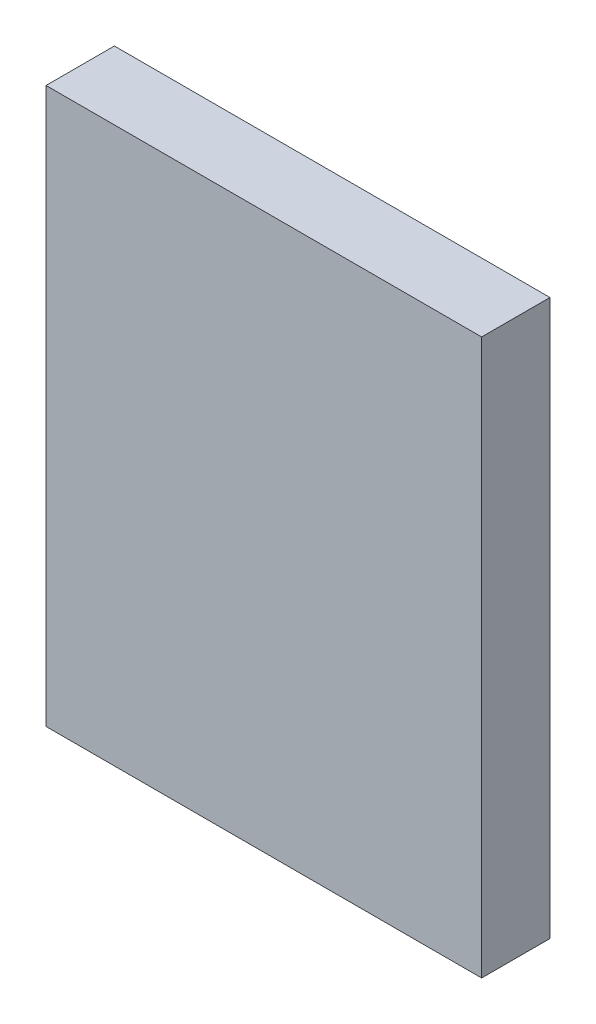
ISO-10303-21;
HEADER;
FILE_DESCRIPTION(('STEP AP214'),'2;1');
FILE_NAME('part.step','',(''),(''),'','','');
FILE_SCHEMA(('AUTOMOTIVE_DESIGN { 1 0 10303 214 1 1 1 1 }'));
ENDSEC;
DATA;
#1=APPLICATION_CONTEXT('core data for automotive mechanical design processes');
#2=APPLICATION_PROTOCOL_DEFINITION('international standard','automotive_design',2000,#1);
#3=PRODUCT_CONTEXT('',#1,'mechanical');
#4=PRODUCT('Part','Part','',(#3));
#5=PRODUCT_RELATED_PRODUCT_CATEGORY('part','',(#4));
#6=PRODUCT_DEFINITION_FORMATION('','',#4);
#7=PRODUCT_DEFINITION_CONTEXT('part definition',#1,'design');
#8=PRODUCT_DEFINITION('design','',#6,#7);
#9=PRODUCT_DEFINITION_SHAPE('','',#8);
#10=(LENGTH_UNIT() NAMED_UNIT(*) SI_UNIT(.MILLI.,.METRE.));
#11=(NAMED_UNIT(*) PLANE_ANGLE_UNIT() SI_UNIT($,.RADIAN.));
#12=(NAMED_UNIT(*) SI_UNIT($,.STERADIAN.) SOLID_ANGLE_UNIT());
#13=UNCERTAINTY_MEASURE_WITH_UNIT(LENGTH_MEASURE(1.E-05),#10,'distance_accuracy_value','');
#14=(GEOMETRIC_REPRESENTATION_CONTEXT(3) GLOBAL_UNCERTAINTY_ASSIGNED_CONTEXT((#13)) GLOBAL_UNIT_ASSIGNED_CONTEXT((#10,
#11,#12)) REPRESENTATION_CONTEXT('',''));
#15=CARTESIAN_POINT('',(0.,0.,0.));
#16=DIRECTION('',(0.,0.,1.));
#17=DIRECTION('',(1.,0.,0.));
#18=AXIS2_PLACEMENT_3D('',#15,#16,#17);
#19=CARTESIAN_POINT('',(-25.8890638481449,19.5723684210526,8.));
#20=DIRECTION('',(1.,0.,0.));
#21=DIRECTION('',(0.,1.,0.));
#22=AXIS2_PLACEMENT_3D('',#19,#20,#21);
#23=PLANE('',#22);
#24=DIRECTION('',(0.,-1.,0.));
#25=VECTOR('',#24,1.);
#26=CARTESIAN_POINT('',(-25.8890638481449,19.5723684210526,0.));
#27=LINE('',#26,#25);
#28=CARTESIAN_POINT('',(-25.8890638481449,19.5723684210526,0.));
#29=VERTEX_POINT('',#28);
#30=CARTESIAN_POINT('',(-25.8890638481449,-45.4276315789474,0.));
#31=VERTEX_POINT('',#30);
#32=EDGE_CURVE('E96',#29,#31,#27,.T.);
#33=ORIENTED_EDGE('',*,*,#32,.T.);
#34=DIRECTION('',(0.,0.,-1.));
#35=VECTOR('',#34,1.);
#36=CARTESIAN_POINT('',(-25.8890638481449,-45.4276315789474,8.));
#37=LINE('',#36,#35);
#38=CARTESIAN_POINT('',(-25.8890638481449,-45.4276315789474,8.));
#39=VERTEX_POINT('',#38);
#40=EDGE_CURVE('E11',#39,#31,#37,.T.);
#41=ORIENTED_EDGE('',*,*,#40,.F.);
#42=DIRECTION('',(0.,-1.,0.));
#43=VECTOR('',#42,1.);
#44=CARTESIAN_POINT('',(-25.8890638481449,19.5723684210526,8.));
#45=LINE('',#44,#43);
#46=CARTESIAN_POINT('',(-25.8890638481449,19.5723684210526,8.));
#47=VERTEX_POINT('',#46);
#48=EDGE_CURVE('E84',#47,#39,#45,.T.);
#49=ORIENTED_EDGE('',*,*,#48,.F.);
#50=DIRECTION('',(0.,0.,-1.));
#51=VECTOR('',#50,1.);
#52=CARTESIAN_POINT('',(-25.8890638481449,19.5723684210526,8.));
#53=LINE('',#52,#51);
#54=EDGE_CURVE('E92',#47,#29,#53,.T.);
#55=ORIENTED_EDGE('',*,*,#54,.T.);
#56=EDGE_LOOP('',(#33,#41,#49,#55));
#57=FACE_BOUND('',#56,.T.);
#58=ADVANCED_FACE('F33',(#57),#23,.F.);
#59=CARTESIAN_POINT('',(-25.8890638481449,-45.4276315789474,8.));
#60=DIRECTION('',(0.,1.,0.));
#61=DIRECTION('',(0.,0.,1.));
#62=AXIS2_PLACEMENT_3D('',#59,#60,#61);
#63=PLANE('',#62);
#64=DIRECTION('',(1.,0.,0.));
#65=VECTOR('',#64,1.);
#66=CARTESIAN_POINT('',(-25.8890638481449,-45.4276315789474,0.));
#67=LINE('',#66,#65);
#68=CARTESIAN_POINT('',(25.1109361518551,-45.4276315789474,0.));
#69=VERTEX_POINT('',#68);
#70=EDGE_CURVE('E88',#31,#69,#67,.T.);
#71=ORIENTED_EDGE('',*,*,#70,.T.);
#72=DIRECTION('',(0.,0.,-1.));
#73=VECTOR('',#72,1.);
#74=CARTESIAN_POINT('',(25.1109361518551,-45.4276315789474,8.));
#75=LINE('',#74,#73);
#76=CARTESIAN_POINT('',(25.1109361518551,-45.4276315789474,8.));
#77=VERTEX_POINT('',#76);
#78=EDGE_CURVE('E41',#77,#69,#75,.T.);
#79=ORIENTED_EDGE('',*,*,#78,.F.);
#80=DIRECTION('',(1.,0.,0.));
#81=VECTOR('',#80,1.);
#82=CARTESIAN_POINT('',(-25.8890638481449,-45.4276315789474,8.));
#83=LINE('',#82,#81);
#84=EDGE_CURVE('E79',#39,#77,#83,.T.);
#85=ORIENTED_EDGE('',*,*,#84,.F.);
#86=ORIENTED_EDGE('',*,*,#40,.T.);
#87=EDGE_LOOP('',(#71,#79,#85,#86));
#88=FACE_BOUND('',#87,.T.);
#89=ADVANCED_FACE('F87',(#88),#63,.F.);
#90=CARTESIAN_POINT('',(25.1109361518551,19.5723684210526,8.));
#91=DIRECTION('',(-1.,0.,0.));
#92=DIRECTION('',(0.,-1.,0.));
#93=AXIS2_PLACEMENT_3D('',#90,#91,#92);
#94=PLANE('',#93);
#95=DIRECTION('',(0.,1.,0.));
#96=VECTOR('',#95,1.);
#97=CARTESIAN_POINT('',(25.1109361518551,19.5723684210526,0.));
#98=LINE('',#97,#96);
#99=CARTESIAN_POINT('',(25.1109361518551,19.5723684210526,0.));
#100=VERTEX_POINT('',#99);
#101=EDGE_CURVE('E66',#69,#100,#98,.T.);
#102=ORIENTED_EDGE('',*,*,#101,.T.);
#103=DIRECTION('',(0.,0.,-1.));
#104=VECTOR('',#103,1.);
#105=CARTESIAN_POINT('',(25.1109361518551,19.5723684210526,8.));
#106=LINE('',#105,#104);
#107=CARTESIAN_POINT('',(25.1109361518551,19.5723684210526,8.));
#108=VERTEX_POINT('',#107);
#109=EDGE_CURVE('E89',#108,#100,#106,.T.);
#110=ORIENTED_EDGE('',*,*,#109,.F.);
#111=DIRECTION('',(0.,1.,0.));
#112=VECTOR('',#111,1.);
#113=CARTESIAN_POINT('',(25.1109361518551,19.5723684210526,8.));
#114=LINE('',#113,#112);
#115=EDGE_CURVE('E82',#77,#108,#114,.T.);
#116=ORIENTED_EDGE('',*,*,#115,.F.);
#117=ORIENTED_EDGE('',*,*,#78,.T.);
#118=EDGE_LOOP('',(#102,#110,#116,#117));
#119=FACE_BOUND('',#118,.T.);
#120=ADVANCED_FACE('F90',(#119),#94,.F.);
#121=CARTESIAN_POINT('',(-25.8890638481449,19.5723684210526,8.));
#122=DIRECTION('',(0.,-1.,0.));
#123=DIRECTION('',(0.,0.,-1.));
#124=AXIS2_PLACEMENT_3D('',#121,#122,#123);
#125=PLANE('',#124);
#126=DIRECTION('',(-1.,0.,0.));
#127=VECTOR('',#126,1.);
#128=CARTESIAN_POINT('',(-25.8890638481449,19.5723684210526,0.));
#129=LINE('',#128,#127);
#130=EDGE_CURVE('E72',#100,#29,#129,.T.);
#131=ORIENTED_EDGE('',*,*,#130,.T.);
#132=ORIENTED_EDGE('',*,*,#54,.F.);
#133=DIRECTION('',(-1.,0.,0.));
#134=VECTOR('',#133,1.);
#135=CARTESIAN_POINT('',(-25.8890638481449,19.5723684210526,8.));
#136=LINE('',#135,#134);
#137=EDGE_CURVE('E49',#108,#47,#136,.T.);
#138=ORIENTED_EDGE('',*,*,#137,.F.);
#139=ORIENTED_EDGE('',*,*,#109,.T.);
#140=EDGE_LOOP('',(#131,#132,#138,#139));
#141=FACE_BOUND('',#140,.T.);
#142=ADVANCED_FACE('F103',(#141),#125,.F.);
#143=CARTESIAN_POINT('',(0.,0.,8.));
#144=DIRECTION('',(0.,0.,1.));
#145=DIRECTION('',(1.,0.,0.));
#146=AXIS2_PLACEMENT_3D('',#143,#144,#145);
#147=PLANE('',#146);
#148=ORIENTED_EDGE('',*,*,#48,.T.);
#149=ORIENTED_EDGE('',*,*,#84,.T.);
#150=ORIENTED_EDGE('',*,*,#115,.T.);
#151=ORIENTED_EDGE('',*,*,#137,.T.);
#152=EDGE_LOOP('',(#148,#149,#150,#151));
#153=FACE_BOUND('',#152,.T.);
#154=ADVANCED_FACE('F80',(#153),#147,.T.);
#155=CARTESIAN_POINT('',(0.,0.,0.));
#156=DIRECTION('',(0.,0.,1.));
#157=DIRECTION('',(1.,0.,0.));
#158=AXIS2_PLACEMENT_3D('',#155,#156,#157);
#159=PLANE('',#158);
#160=ORIENTED_EDGE('',*,*,#32,.F.);
#161=ORIENTED_EDGE('',*,*,#130,.F.);
#162=ORIENTED_EDGE('',*,*,#101,.F.);
#163=ORIENTED_EDGE('',*,*,#70,.F.);
#164=EDGE_LOOP('',(#160,#161,#162,#163));
#165=FACE_BOUND('',#164,.T.);
#166=ADVANCED_FACE('F106',(#165),#159,.F.);
#167=CLOSED_SHELL('',(#58,#89,#120,#142,#154,#166));
#168=MANIFOLD_SOLID_BREP('B2',#167);
#169=ADVANCED_BREP_SHAPE_REPRESENTATION('',(#18,#168),#14);
#170=SHAPE_DEFINITION_REPRESENTATION(#9,#169);
ENDSEC;
END-ISO-10303-21;
